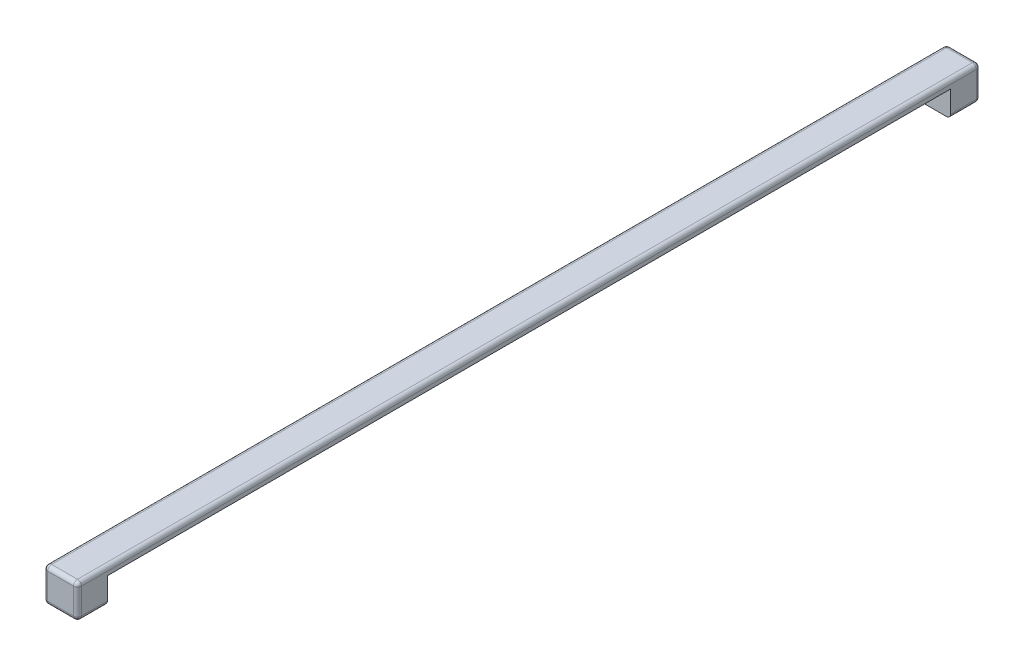
ISO-10303-21;
HEADER;
FILE_DESCRIPTION(('STEP AP214'),'2;1');
FILE_NAME('part.step','',(''),(''),'','','');
FILE_SCHEMA(('AUTOMOTIVE_DESIGN { 1 0 10303 214 1 1 1 1 }'));
ENDSEC;
DATA;
#1=APPLICATION_CONTEXT('core data for automotive mechanical design processes');
#2=APPLICATION_PROTOCOL_DEFINITION('international standard','automotive_design',2000,#1);
#3=PRODUCT_CONTEXT('',#1,'mechanical');
#4=PRODUCT('Part','Part','',(#3));
#5=PRODUCT_RELATED_PRODUCT_CATEGORY('part','',(#4));
#6=PRODUCT_DEFINITION_FORMATION('','',#4);
#7=PRODUCT_DEFINITION_CONTEXT('part definition',#1,'design');
#8=PRODUCT_DEFINITION('design','',#6,#7);
#9=PRODUCT_DEFINITION_SHAPE('','',#8);
#10=(LENGTH_UNIT() NAMED_UNIT(*) SI_UNIT(.MILLI.,.METRE.));
#11=(NAMED_UNIT(*) PLANE_ANGLE_UNIT() SI_UNIT($,.RADIAN.));
#12=(NAMED_UNIT(*) SI_UNIT($,.STERADIAN.) SOLID_ANGLE_UNIT());
#13=UNCERTAINTY_MEASURE_WITH_UNIT(LENGTH_MEASURE(1.E-05),#10,'distance_accuracy_value','');
#14=(GEOMETRIC_REPRESENTATION_CONTEXT(3) GLOBAL_UNCERTAINTY_ASSIGNED_CONTEXT((#13)) GLOBAL_UNIT_ASSIGNED_CONTEXT((#10,
#11,#12)) REPRESENTATION_CONTEXT('',''));
#15=CARTESIAN_POINT('',(0.,0.,0.));
#16=DIRECTION('',(0.,0.,1.));
#17=DIRECTION('',(1.,0.,0.));
#18=AXIS2_PLACEMENT_3D('',#15,#16,#17);
#19=CARTESIAN_POINT('',(4.25,-4.25,113.5));
#20=DIRECTION('',(-1.,0.,0.));
#21=DIRECTION('',(0.,0.,1.));
#22=AXIS2_PLACEMENT_3D('',#19,#20,#21);
#23=PLANE('',#22);
#24=DIRECTION('',(0.,-1.,0.));
#25=VECTOR('',#24,1.);
#26=CARTESIAN_POINT('',(4.25,-4.25,106.));
#27=LINE('',#26,#25);
#28=CARTESIAN_POINT('',(4.25,2.25,106.));
#29=VERTEX_POINT('',#28);
#30=CARTESIAN_POINT('',(4.25,-3.25,106.));
#31=VERTEX_POINT('',#30);
#32=EDGE_CURVE('E190',#29,#31,#27,.T.);
#33=ORIENTED_EDGE('',*,*,#32,.F.);
#34=DIRECTION('',(0.,0.,-1.));
#35=VECTOR('',#34,1.);
#36=CARTESIAN_POINT('',(4.25,2.25,122.692388155425));
#37=LINE('',#36,#35);
#38=CARTESIAN_POINT('',(4.25,2.25,-106.));
#39=VERTEX_POINT('',#38);
#40=EDGE_CURVE('E172',#29,#39,#37,.T.);
#41=ORIENTED_EDGE('',*,*,#40,.T.);
#42=DIRECTION('',(0.,1.,0.));
#43=VECTOR('',#42,1.);
#44=CARTESIAN_POINT('',(4.25,-4.25,-106.));
#45=LINE('',#44,#43);
#46=CARTESIAN_POINT('',(4.25,-3.25,-106.));
#47=VERTEX_POINT('',#46);
#48=EDGE_CURVE('E181',#47,#39,#45,.T.);
#49=ORIENTED_EDGE('',*,*,#48,.F.);
#50=DIRECTION('',(0.,0.,-1.));
#51=VECTOR('',#50,1.);
#52=CARTESIAN_POINT('',(4.25,-3.25,113.5));
#53=LINE('',#52,#51);
#54=CARTESIAN_POINT('',(4.25,-3.25,-112.5));
#55=VERTEX_POINT('',#54);
#56=EDGE_CURVE('E224',#47,#55,#53,.T.);
#57=ORIENTED_EDGE('',*,*,#56,.T.);
#58=DIRECTION('',(0.,1.,0.));
#59=VECTOR('',#58,1.);
#60=CARTESIAN_POINT('',(4.25,4.25,-112.5));
#61=LINE('',#60,#59);
#62=CARTESIAN_POINT('',(4.25,3.25,-112.5));
#63=VERTEX_POINT('',#62);
#64=EDGE_CURVE('E228',#55,#63,#61,.T.);
#65=ORIENTED_EDGE('',*,*,#64,.T.);
#66=DIRECTION('',(0.,0.,-1.));
#67=VECTOR('',#66,1.);
#68=CARTESIAN_POINT('',(4.25,3.25,113.5));
#69=LINE('',#68,#67);
#70=CARTESIAN_POINT('',(4.25,3.25,112.5));
#71=VERTEX_POINT('',#70);
#72=EDGE_CURVE('E230',#63,#71,#69,.F.);
#73=ORIENTED_EDGE('',*,*,#72,.T.);
#74=DIRECTION('',(0.,1.,0.));
#75=VECTOR('',#74,1.);
#76=CARTESIAN_POINT('',(4.25,-4.25,112.5));
#77=LINE('',#76,#75);
#78=CARTESIAN_POINT('',(4.25,-3.25,112.5));
#79=VERTEX_POINT('',#78);
#80=EDGE_CURVE('E232',#71,#79,#77,.F.);
#81=ORIENTED_EDGE('',*,*,#80,.T.);
#82=EDGE_CURVE('E225',#79,#31,#53,.T.);
#83=ORIENTED_EDGE('',*,*,#82,.T.);
#84=EDGE_LOOP('',(#33,#41,#49,#57,#65,#73,#81,#83));
#85=FACE_BOUND('',#84,.T.);
#86=ADVANCED_FACE('F40',(#85),#23,.F.);
#87=CARTESIAN_POINT('',(-4.25,-4.25,113.5));
#88=DIRECTION('',(0.,1.,0.));
#89=DIRECTION('',(0.,0.,1.));
#90=AXIS2_PLACEMENT_3D('',#87,#88,#89);
#91=PLANE('',#90);
#92=DIRECTION('',(-1.,0.,0.));
#93=VECTOR('',#92,1.);
#94=CARTESIAN_POINT('',(4.25,-4.25,106.));
#95=LINE('',#94,#93);
#96=CARTESIAN_POINT('',(3.25,-4.25,106.));
#97=VERTEX_POINT('',#96);
#98=CARTESIAN_POINT('',(-2.25,-4.25,106.));
#99=VERTEX_POINT('',#98);
#100=EDGE_CURVE('E188',#97,#99,#95,.T.);
#101=ORIENTED_EDGE('',*,*,#100,.F.);
#102=DIRECTION('',(0.,0.,-1.));
#103=VECTOR('',#102,1.);
#104=CARTESIAN_POINT('',(3.25,-4.25,113.5));
#105=LINE('',#104,#103);
#106=CARTESIAN_POINT('',(3.25,-4.25,112.5));
#107=VERTEX_POINT('',#106);
#108=EDGE_CURVE('E246',#97,#107,#105,.F.);
#109=ORIENTED_EDGE('',*,*,#108,.T.);
#110=DIRECTION('',(1.,0.,0.));
#111=VECTOR('',#110,1.);
#112=CARTESIAN_POINT('',(-4.25,-4.25,112.5));
#113=LINE('',#112,#111);
#114=CARTESIAN_POINT('',(-3.25,-4.25,112.5));
#115=VERTEX_POINT('',#114);
#116=EDGE_CURVE('E63',#107,#115,#113,.F.);
#117=ORIENTED_EDGE('',*,*,#116,.T.);
#118=DIRECTION('',(0.,0.,-1.));
#119=VECTOR('',#118,1.);
#120=CARTESIAN_POINT('',(-3.25,-4.25,113.5));
#121=LINE('',#120,#119);
#122=CARTESIAN_POINT('',(-3.25,-4.25,-112.5));
#123=VERTEX_POINT('',#122);
#124=EDGE_CURVE('E251',#115,#123,#121,.T.);
#125=ORIENTED_EDGE('',*,*,#124,.T.);
#126=DIRECTION('',(1.,0.,0.));
#127=VECTOR('',#126,1.);
#128=CARTESIAN_POINT('',(4.25,-4.25,-112.5));
#129=LINE('',#128,#127);
#130=CARTESIAN_POINT('',(3.25,-4.25,-112.5));
#131=VERTEX_POINT('',#130);
#132=EDGE_CURVE('E244',#123,#131,#129,.T.);
#133=ORIENTED_EDGE('',*,*,#132,.T.);
#134=CARTESIAN_POINT('',(3.25,-4.25,-106.));
#135=VERTEX_POINT('',#134);
#136=EDGE_CURVE('E247',#131,#135,#105,.F.);
#137=ORIENTED_EDGE('',*,*,#136,.T.);
#138=DIRECTION('',(1.,0.,0.));
#139=VECTOR('',#138,1.);
#140=CARTESIAN_POINT('',(4.25,-4.25,-106.));
#141=LINE('',#140,#139);
#142=CARTESIAN_POINT('',(-2.25,-4.25,-106.));
#143=VERTEX_POINT('',#142);
#144=EDGE_CURVE('E55',#143,#135,#141,.T.);
#145=ORIENTED_EDGE('',*,*,#144,.F.);
#146=DIRECTION('',(0.,0.,-1.));
#147=VECTOR('',#146,1.);
#148=CARTESIAN_POINT('',(-2.25,-4.25,122.692388155425));
#149=LINE('',#148,#147);
#150=EDGE_CURVE('E173',#99,#143,#149,.T.);
#151=ORIENTED_EDGE('',*,*,#150,.F.);
#152=EDGE_LOOP('',(#101,#109,#117,#125,#133,#137,#145,#151));
#153=FACE_BOUND('',#152,.T.);
#154=ADVANCED_FACE('F370',(#153),#91,.F.);
#155=CARTESIAN_POINT('',(3.25,-3.25,113.5));
#156=DIRECTION('',(0.,0.,-1.));
#157=DIRECTION('',(-1.,0.,0.));
#158=AXIS2_PLACEMENT_3D('',#155,#156,#157);
#159=CYLINDRICAL_SURFACE('',#158,1.);
#160=ORIENTED_EDGE('',*,*,#108,.F.);
#161=CARTESIAN_POINT('',(3.25,-3.25,106.));
#162=DIRECTION('',(0.,0.,-1.));
#163=DIRECTION('',(-1.,0.,0.));
#164=AXIS2_PLACEMENT_3D('',#161,#162,#163);
#165=CIRCLE('',#164,1.);
#166=EDGE_CURVE('E12',#97,#31,#165,.F.);
#167=ORIENTED_EDGE('',*,*,#166,.T.);
#168=ORIENTED_EDGE('',*,*,#82,.F.);
#169=CARTESIAN_POINT('',(3.25,-3.25,112.5));
#170=DIRECTION('',(0.,0.,1.));
#171=DIRECTION('',(1.,0.,0.));
#172=AXIS2_PLACEMENT_3D('',#169,#170,#171);
#173=CIRCLE('',#172,1.);
#174=EDGE_CURVE('E293',#107,#79,#173,.T.);
#175=ORIENTED_EDGE('',*,*,#174,.F.);
#176=EDGE_LOOP('',(#160,#167,#168,#175));
#177=FACE_BOUND('',#176,.T.);
#178=ADVANCED_FACE('F366',(#177),#159,.T.);
#179=CARTESIAN_POINT('',(-4.25,4.25,113.5));
#180=DIRECTION('',(0.,-1.,0.));
#181=DIRECTION('',(0.,0.,-1.));
#182=AXIS2_PLACEMENT_3D('',#179,#180,#181);
#183=PLANE('',#182);
#184=DIRECTION('',(0.,0.,-1.));
#185=VECTOR('',#184,1.);
#186=CARTESIAN_POINT('',(-3.25,4.25,113.5));
#187=LINE('',#186,#185);
#188=CARTESIAN_POINT('',(-3.25,4.25,-112.5));
#189=VERTEX_POINT('',#188);
#190=CARTESIAN_POINT('',(-3.25,4.25,112.5));
#191=VERTEX_POINT('',#190);
#192=EDGE_CURVE('E210',#189,#191,#187,.F.);
#193=ORIENTED_EDGE('',*,*,#192,.T.);
#194=DIRECTION('',(-1.,0.,0.));
#195=VECTOR('',#194,1.);
#196=CARTESIAN_POINT('',(-4.25,4.25,112.5));
#197=LINE('',#196,#195);
#198=CARTESIAN_POINT('',(3.25,4.25,112.5));
#199=VERTEX_POINT('',#198);
#200=EDGE_CURVE('E212',#191,#199,#197,.F.);
#201=ORIENTED_EDGE('',*,*,#200,.T.);
#202=DIRECTION('',(0.,0.,-1.));
#203=VECTOR('',#202,1.);
#204=CARTESIAN_POINT('',(3.25,4.25,113.5));
#205=LINE('',#204,#203);
#206=CARTESIAN_POINT('',(3.25,4.25,-112.5));
#207=VERTEX_POINT('',#206);
#208=EDGE_CURVE('E208',#199,#207,#205,.T.);
#209=ORIENTED_EDGE('',*,*,#208,.T.);
#210=DIRECTION('',(-1.,0.,0.));
#211=VECTOR('',#210,1.);
#212=CARTESIAN_POINT('',(-4.25,4.25,-112.5));
#213=LINE('',#212,#211);
#214=EDGE_CURVE('E206',#207,#189,#213,.T.);
#215=ORIENTED_EDGE('',*,*,#214,.T.);
#216=EDGE_LOOP('',(#193,#201,#209,#215));
#217=FACE_BOUND('',#216,.T.);
#218=ADVANCED_FACE('F398',(#217),#183,.F.);
#219=CARTESIAN_POINT('',(-4.25,-4.25,113.5));
#220=DIRECTION('',(1.,0.,0.));
#221=DIRECTION('',(0.,0.,-1.));
#222=AXIS2_PLACEMENT_3D('',#219,#220,#221);
#223=PLANE('',#222);
#224=DIRECTION('',(0.,-1.,0.));
#225=VECTOR('',#224,1.);
#226=CARTESIAN_POINT('',(-4.25,-4.25,112.5));
#227=LINE('',#226,#225);
#228=CARTESIAN_POINT('',(-4.25,-3.25,112.5));
#229=VERTEX_POINT('',#228);
#230=CARTESIAN_POINT('',(-4.25,3.25,112.5));
#231=VERTEX_POINT('',#230);
#232=EDGE_CURVE('E219',#229,#231,#227,.F.);
#233=ORIENTED_EDGE('',*,*,#232,.T.);
#234=DIRECTION('',(0.,0.,-1.));
#235=VECTOR('',#234,1.);
#236=CARTESIAN_POINT('',(-4.25,3.25,113.5));
#237=LINE('',#236,#235);
#238=CARTESIAN_POINT('',(-4.25,3.25,-112.5));
#239=VERTEX_POINT('',#238);
#240=EDGE_CURVE('E221',#231,#239,#237,.T.);
#241=ORIENTED_EDGE('',*,*,#240,.T.);
#242=DIRECTION('',(0.,-1.,0.));
#243=VECTOR('',#242,1.);
#244=CARTESIAN_POINT('',(-4.25,-4.25,-112.5));
#245=LINE('',#244,#243);
#246=CARTESIAN_POINT('',(-4.25,-3.25,-112.5));
#247=VERTEX_POINT('',#246);
#248=EDGE_CURVE('E217',#239,#247,#245,.T.);
#249=ORIENTED_EDGE('',*,*,#248,.T.);
#250=DIRECTION('',(0.,0.,-1.));
#251=VECTOR('',#250,1.);
#252=CARTESIAN_POINT('',(-4.25,-3.25,113.5));
#253=LINE('',#252,#251);
#254=EDGE_CURVE('E215',#247,#229,#253,.F.);
#255=ORIENTED_EDGE('',*,*,#254,.T.);
#256=EDGE_LOOP('',(#233,#241,#249,#255));
#257=FACE_BOUND('',#256,.T.);
#258=ADVANCED_FACE('F602',(#257),#223,.F.);
#259=CARTESIAN_POINT('',(0.,0.,113.5));
#260=DIRECTION('',(0.,0.,-1.));
#261=DIRECTION('',(-1.,0.,0.));
#262=AXIS2_PLACEMENT_3D('',#259,#260,#261);
#263=PLANE('',#262);
#264=DIRECTION('',(0.,1.,0.));
#265=VECTOR('',#264,1.);
#266=CARTESIAN_POINT('',(3.25,0.,113.5));
#267=LINE('',#266,#265);
#268=CARTESIAN_POINT('',(3.25,-3.25,113.5));
#269=VERTEX_POINT('',#268);
#270=CARTESIAN_POINT('',(3.25,3.25,113.5));
#271=VERTEX_POINT('',#270);
#272=EDGE_CURVE('E198',#269,#271,#267,.T.);
#273=ORIENTED_EDGE('',*,*,#272,.T.);
#274=DIRECTION('',(-1.,0.,0.));
#275=VECTOR('',#274,1.);
#276=CARTESIAN_POINT('',(0.,3.25,113.5));
#277=LINE('',#276,#275);
#278=CARTESIAN_POINT('',(-3.25,3.25,113.5));
#279=VERTEX_POINT('',#278);
#280=EDGE_CURVE('E203',#271,#279,#277,.T.);
#281=ORIENTED_EDGE('',*,*,#280,.T.);
#282=DIRECTION('',(0.,-1.,0.));
#283=VECTOR('',#282,1.);
#284=CARTESIAN_POINT('',(-3.25,0.,113.5));
#285=LINE('',#284,#283);
#286=CARTESIAN_POINT('',(-3.25,-3.25,113.5));
#287=VERTEX_POINT('',#286);
#288=EDGE_CURVE('E201',#279,#287,#285,.T.);
#289=ORIENTED_EDGE('',*,*,#288,.T.);
#290=DIRECTION('',(1.,0.,0.));
#291=VECTOR('',#290,1.);
#292=CARTESIAN_POINT('',(0.,-3.25,113.5));
#293=LINE('',#292,#291);
#294=EDGE_CURVE('E196',#287,#269,#293,.T.);
#295=ORIENTED_EDGE('',*,*,#294,.T.);
#296=EDGE_LOOP('',(#273,#281,#289,#295));
#297=FACE_BOUND('',#296,.T.);
#298=ADVANCED_FACE('F353',(#297),#263,.F.);
#299=CARTESIAN_POINT('',(0.,0.,-113.5));
#300=DIRECTION('',(0.,0.,-1.));
#301=DIRECTION('',(-1.,0.,0.));
#302=AXIS2_PLACEMENT_3D('',#299,#300,#301);
#303=PLANE('',#302);
#304=DIRECTION('',(0.,-1.,0.));
#305=VECTOR('',#304,1.);
#306=CARTESIAN_POINT('',(-3.25,4.25,-113.5));
#307=LINE('',#306,#305);
#308=CARTESIAN_POINT('',(-3.25,-3.25,-113.5));
#309=VERTEX_POINT('',#308);
#310=CARTESIAN_POINT('',(-3.25,3.25,-113.5));
#311=VERTEX_POINT('',#310);
#312=EDGE_CURVE('E239',#309,#311,#307,.F.);
#313=ORIENTED_EDGE('',*,*,#312,.T.);
#314=DIRECTION('',(-1.,0.,0.));
#315=VECTOR('',#314,1.);
#316=CARTESIAN_POINT('',(4.25,3.25,-113.5));
#317=LINE('',#316,#315);
#318=CARTESIAN_POINT('',(3.25,3.25,-113.5));
#319=VERTEX_POINT('',#318);
#320=EDGE_CURVE('E241',#311,#319,#317,.F.);
#321=ORIENTED_EDGE('',*,*,#320,.T.);
#322=DIRECTION('',(0.,1.,0.));
#323=VECTOR('',#322,1.);
#324=CARTESIAN_POINT('',(3.25,-4.25,-113.5));
#325=LINE('',#324,#323);
#326=CARTESIAN_POINT('',(3.25,-3.25,-113.5));
#327=VERTEX_POINT('',#326);
#328=EDGE_CURVE('E237',#319,#327,#325,.F.);
#329=ORIENTED_EDGE('',*,*,#328,.T.);
#330=DIRECTION('',(1.,0.,0.));
#331=VECTOR('',#330,1.);
#332=CARTESIAN_POINT('',(-4.25,-3.25,-113.5));
#333=LINE('',#332,#331);
#334=EDGE_CURVE('E235',#327,#309,#333,.F.);
#335=ORIENTED_EDGE('',*,*,#334,.T.);
#336=EDGE_LOOP('',(#313,#321,#329,#335));
#337=FACE_BOUND('',#336,.T.);
#338=ADVANCED_FACE('F377',(#337),#303,.T.);
#339=CARTESIAN_POINT('',(-4.25,-3.25,-112.5));
#340=DIRECTION('',(-1.,0.,0.));
#341=DIRECTION('',(0.,0.,1.));
#342=AXIS2_PLACEMENT_3D('',#339,#340,#341);
#343=CYLINDRICAL_SURFACE('',#342,1.);
#344=CARTESIAN_POINT('',(3.25,-3.25,-112.5));
#345=DIRECTION('',(1.,0.,0.));
#346=DIRECTION('',(0.,0.,-1.));
#347=AXIS2_PLACEMENT_3D('',#344,#345,#346);
#348=CIRCLE('',#347,1.);
#349=EDGE_CURVE('E199',#131,#327,#348,.T.);
#350=ORIENTED_EDGE('',*,*,#349,.F.);
#351=ORIENTED_EDGE('',*,*,#132,.F.);
#352=CARTESIAN_POINT('',(-3.25,-3.25,-112.5));
#353=DIRECTION('',(-1.,0.,0.));
#354=DIRECTION('',(0.,0.,1.));
#355=AXIS2_PLACEMENT_3D('',#352,#353,#354);
#356=CIRCLE('',#355,1.);
#357=EDGE_CURVE('E312',#309,#123,#356,.T.);
#358=ORIENTED_EDGE('',*,*,#357,.F.);
#359=ORIENTED_EDGE('',*,*,#334,.F.);
#360=EDGE_LOOP('',(#350,#351,#358,#359));
#361=FACE_BOUND('',#360,.T.);
#362=ADVANCED_FACE('F42',(#361),#343,.T.);
#363=CARTESIAN_POINT('',(3.25,-3.25,-112.5));
#364=DIRECTION('',(0.,0.,1.));
#365=DIRECTION('',(1.,0.,0.));
#366=AXIS2_PLACEMENT_3D('',#363,#364,#365);
#367=SPHERICAL_SURFACE('',#366,1.);
#368=CARTESIAN_POINT('',(3.25,-3.25,-112.5));
#369=DIRECTION('',(0.,0.,-1.));
#370=DIRECTION('',(-1.,0.,0.));
#371=AXIS2_PLACEMENT_3D('',#368,#369,#370);
#372=CIRCLE('',#371,1.);
#373=EDGE_CURVE('E306',#131,#55,#372,.F.);
#374=ORIENTED_EDGE('',*,*,#373,.F.);
#375=ORIENTED_EDGE('',*,*,#349,.T.);
#376=CARTESIAN_POINT('',(3.25,-3.25,-112.5));
#377=DIRECTION('',(0.,-1.,0.));
#378=DIRECTION('',(0.,0.,-1.));
#379=AXIS2_PLACEMENT_3D('',#376,#377,#378);
#380=CIRCLE('',#379,1.);
#381=EDGE_CURVE('E309',#55,#327,#380,.F.);
#382=ORIENTED_EDGE('',*,*,#381,.F.);
#383=EDGE_LOOP('',(#374,#375,#382));
#384=FACE_BOUND('',#383,.T.);
#385=ADVANCED_FACE('F326',(#384),#367,.T.);
#386=CARTESIAN_POINT('',(-3.25,-3.25,-112.5));
#387=DIRECTION('',(0.,0.,1.));
#388=DIRECTION('',(1.,0.,0.));
#389=AXIS2_PLACEMENT_3D('',#386,#387,#388);
#390=SPHERICAL_SURFACE('',#389,1.);
#391=CARTESIAN_POINT('',(-3.25,-3.25,-112.5));
#392=DIRECTION('',(0.,-1.,0.));
#393=DIRECTION('',(0.,0.,-1.));
#394=AXIS2_PLACEMENT_3D('',#391,#392,#393);
#395=CIRCLE('',#394,1.);
#396=EDGE_CURVE('E301',#309,#247,#395,.F.);
#397=ORIENTED_EDGE('',*,*,#396,.F.);
#398=ORIENTED_EDGE('',*,*,#357,.T.);
#399=CARTESIAN_POINT('',(-3.25,-3.25,-112.5));
#400=DIRECTION('',(0.,0.,-1.));
#401=DIRECTION('',(-1.,0.,0.));
#402=AXIS2_PLACEMENT_3D('',#399,#400,#401);
#403=CIRCLE('',#402,1.);
#404=EDGE_CURVE('E304',#247,#123,#403,.F.);
#405=ORIENTED_EDGE('',*,*,#404,.F.);
#406=EDGE_LOOP('',(#397,#398,#405));
#407=FACE_BOUND('',#406,.T.);
#408=ADVANCED_FACE('F451',(#407),#390,.T.);
#409=CARTESIAN_POINT('',(3.25,-4.25,-112.5));
#410=DIRECTION('',(0.,-1.,0.));
#411=DIRECTION('',(0.,0.,-1.));
#412=AXIS2_PLACEMENT_3D('',#409,#410,#411);
#413=CYLINDRICAL_SURFACE('',#412,1.);
#414=ORIENTED_EDGE('',*,*,#381,.T.);
#415=ORIENTED_EDGE('',*,*,#328,.F.);
#416=CARTESIAN_POINT('',(3.25,3.25,-112.5));
#417=DIRECTION('',(0.,1.,0.));
#418=DIRECTION('',(0.,0.,1.));
#419=AXIS2_PLACEMENT_3D('',#416,#417,#418);
#420=CIRCLE('',#419,1.);
#421=EDGE_CURVE('E296',#63,#319,#420,.T.);
#422=ORIENTED_EDGE('',*,*,#421,.F.);
#423=ORIENTED_EDGE('',*,*,#64,.F.);
#424=EDGE_LOOP('',(#414,#415,#422,#423));
#425=FACE_BOUND('',#424,.T.);
#426=ADVANCED_FACE('F331',(#425),#413,.T.);
#427=CARTESIAN_POINT('',(3.25,-3.25,-106.));
#428=DIRECTION('',(0.,0.,-1.));
#429=DIRECTION('',(-1.,0.,0.));
#430=AXIS2_PLACEMENT_3D('',#427,#428,#429);
#431=CIRCLE('',#430,1.);
#432=EDGE_CURVE('E48',#135,#47,#431,.F.);
#433=ORIENTED_EDGE('',*,*,#432,.F.);
#434=ORIENTED_EDGE('',*,*,#136,.F.);
#435=ORIENTED_EDGE('',*,*,#373,.T.);
#436=ORIENTED_EDGE('',*,*,#56,.F.);
#437=EDGE_LOOP('',(#433,#434,#435,#436));
#438=FACE_BOUND('',#437,.T.);
#439=ADVANCED_FACE('F321',(#438),#159,.T.);
#440=CARTESIAN_POINT('',(0.,-3.25,112.5));
#441=DIRECTION('',(1.,0.,0.));
#442=DIRECTION('',(0.,0.,-1.));
#443=AXIS2_PLACEMENT_3D('',#440,#441,#442);
#444=CYLINDRICAL_SURFACE('',#443,1.);
#445=CARTESIAN_POINT('',(-3.25,-3.25,112.5));
#446=DIRECTION('',(-1.,0.,0.));
#447=DIRECTION('',(0.,0.,1.));
#448=AXIS2_PLACEMENT_3D('',#445,#446,#447);
#449=CIRCLE('',#448,1.);
#450=EDGE_CURVE('E287',#115,#287,#449,.T.);
#451=ORIENTED_EDGE('',*,*,#450,.F.);
#452=ORIENTED_EDGE('',*,*,#116,.F.);
#453=CARTESIAN_POINT('',(3.25,-3.25,112.5));
#454=DIRECTION('',(1.,0.,0.));
#455=DIRECTION('',(0.,0.,-1.));
#456=AXIS2_PLACEMENT_3D('',#453,#454,#455);
#457=CIRCLE('',#456,1.);
#458=EDGE_CURVE('E290',#269,#107,#457,.T.);
#459=ORIENTED_EDGE('',*,*,#458,.F.);
#460=ORIENTED_EDGE('',*,*,#294,.F.);
#461=EDGE_LOOP('',(#451,#452,#459,#460));
#462=FACE_BOUND('',#461,.T.);
#463=ADVANCED_FACE('F359',(#462),#444,.T.);
#464=CARTESIAN_POINT('',(-3.25,-3.25,113.5));
#465=DIRECTION('',(0.,0.,-1.));
#466=DIRECTION('',(-1.,0.,0.));
#467=AXIS2_PLACEMENT_3D('',#464,#465,#466);
#468=CYLINDRICAL_SURFACE('',#467,1.);
#469=ORIENTED_EDGE('',*,*,#404,.T.);
#470=ORIENTED_EDGE('',*,*,#124,.F.);
#471=CARTESIAN_POINT('',(-3.25,-3.25,112.5));
#472=DIRECTION('',(0.,0.,1.));
#473=DIRECTION('',(1.,0.,0.));
#474=AXIS2_PLACEMENT_3D('',#471,#472,#473);
#475=CIRCLE('',#474,1.);
#476=EDGE_CURVE('E284',#229,#115,#475,.T.);
#477=ORIENTED_EDGE('',*,*,#476,.F.);
#478=ORIENTED_EDGE('',*,*,#254,.F.);
#479=EDGE_LOOP('',(#469,#470,#477,#478));
#480=FACE_BOUND('',#479,.T.);
#481=ADVANCED_FACE('F448',(#480),#468,.T.);
#482=CARTESIAN_POINT('',(-3.25,-4.25,-112.5));
#483=DIRECTION('',(0.,1.,0.));
#484=DIRECTION('',(0.,0.,1.));
#485=AXIS2_PLACEMENT_3D('',#482,#483,#484);
#486=CYLINDRICAL_SURFACE('',#485,1.);
#487=ORIENTED_EDGE('',*,*,#396,.T.);
#488=ORIENTED_EDGE('',*,*,#248,.F.);
#489=CARTESIAN_POINT('',(-3.25,3.25,-112.5));
#490=DIRECTION('',(0.,1.,0.));
#491=DIRECTION('',(0.,0.,1.));
#492=AXIS2_PLACEMENT_3D('',#489,#490,#491);
#493=CIRCLE('',#492,1.);
#494=EDGE_CURVE('E281',#311,#239,#493,.T.);
#495=ORIENTED_EDGE('',*,*,#494,.F.);
#496=ORIENTED_EDGE('',*,*,#312,.F.);
#497=EDGE_LOOP('',(#487,#488,#495,#496));
#498=FACE_BOUND('',#497,.T.);
#499=ADVANCED_FACE('F389',(#498),#486,.T.);
#500=CARTESIAN_POINT('',(-4.25,3.25,-112.5));
#501=DIRECTION('',(1.,0.,0.));
#502=DIRECTION('',(0.,0.,-1.));
#503=AXIS2_PLACEMENT_3D('',#500,#501,#502);
#504=CYLINDRICAL_SURFACE('',#503,1.);
#505=CARTESIAN_POINT('',(3.25,3.25,-112.5));
#506=DIRECTION('',(1.,0.,0.));
#507=DIRECTION('',(0.,0.,-1.));
#508=AXIS2_PLACEMENT_3D('',#505,#506,#507);
#509=CIRCLE('',#508,1.);
#510=EDGE_CURVE('E298',#319,#207,#509,.T.);
#511=ORIENTED_EDGE('',*,*,#510,.F.);
#512=ORIENTED_EDGE('',*,*,#320,.F.);
#513=CARTESIAN_POINT('',(-3.25,3.25,-112.5));
#514=DIRECTION('',(-1.,0.,0.));
#515=DIRECTION('',(0.,0.,1.));
#516=AXIS2_PLACEMENT_3D('',#513,#514,#515);
#517=CIRCLE('',#516,1.);
#518=EDGE_CURVE('E278',#189,#311,#517,.T.);
#519=ORIENTED_EDGE('',*,*,#518,.F.);
#520=ORIENTED_EDGE('',*,*,#214,.F.);
#521=EDGE_LOOP('',(#511,#512,#519,#520));
#522=FACE_BOUND('',#521,.T.);
#523=ADVANCED_FACE('F384',(#522),#504,.T.);
#524=CARTESIAN_POINT('',(3.25,3.25,-112.5));
#525=DIRECTION('',(0.,0.,1.));
#526=DIRECTION('',(1.,0.,0.));
#527=AXIS2_PLACEMENT_3D('',#524,#525,#526);
#528=SPHERICAL_SURFACE('',#527,1.);
#529=ORIENTED_EDGE('',*,*,#421,.T.);
#530=ORIENTED_EDGE('',*,*,#510,.T.);
#531=CARTESIAN_POINT('',(3.25,3.25,-112.5));
#532=DIRECTION('',(0.,0.,-1.));
#533=DIRECTION('',(-1.,0.,0.));
#534=AXIS2_PLACEMENT_3D('',#531,#532,#533);
#535=CIRCLE('',#534,1.);
#536=EDGE_CURVE('E275',#63,#207,#535,.F.);
#537=ORIENTED_EDGE('',*,*,#536,.F.);
#538=EDGE_LOOP('',(#529,#530,#537));
#539=FACE_BOUND('',#538,.T.);
#540=ADVANCED_FACE('F400',(#539),#528,.T.);
#541=CARTESIAN_POINT('',(3.25,-3.25,112.5));
#542=DIRECTION('',(0.,0.,1.));
#543=DIRECTION('',(1.,0.,0.));
#544=AXIS2_PLACEMENT_3D('',#541,#542,#543);
#545=SPHERICAL_SURFACE('',#544,1.);
#546=ORIENTED_EDGE('',*,*,#458,.T.);
#547=ORIENTED_EDGE('',*,*,#174,.T.);
#548=CARTESIAN_POINT('',(3.25,-3.25,112.5));
#549=DIRECTION('',(0.,-1.,0.));
#550=DIRECTION('',(0.,0.,-1.));
#551=AXIS2_PLACEMENT_3D('',#548,#549,#550);
#552=CIRCLE('',#551,1.);
#553=EDGE_CURVE('E273',#269,#79,#552,.F.);
#554=ORIENTED_EDGE('',*,*,#553,.F.);
#555=EDGE_LOOP('',(#546,#547,#554));
#556=FACE_BOUND('',#555,.T.);
#557=ADVANCED_FACE('F362',(#556),#545,.T.);
#558=CARTESIAN_POINT('',(-3.25,-3.25,112.5));
#559=DIRECTION('',(0.,0.,1.));
#560=DIRECTION('',(1.,0.,0.));
#561=AXIS2_PLACEMENT_3D('',#558,#559,#560);
#562=SPHERICAL_SURFACE('',#561,1.);
#563=ORIENTED_EDGE('',*,*,#476,.T.);
#564=ORIENTED_EDGE('',*,*,#450,.T.);
#565=CARTESIAN_POINT('',(-3.25,-3.25,112.5));
#566=DIRECTION('',(0.,-1.,0.));
#567=DIRECTION('',(0.,0.,-1.));
#568=AXIS2_PLACEMENT_3D('',#565,#566,#567);
#569=CIRCLE('',#568,1.);
#570=EDGE_CURVE('E270',#229,#287,#569,.F.);
#571=ORIENTED_EDGE('',*,*,#570,.F.);
#572=EDGE_LOOP('',(#563,#564,#571));
#573=FACE_BOUND('',#572,.T.);
#574=ADVANCED_FACE('F407',(#573),#562,.T.);
#575=CARTESIAN_POINT('',(-3.25,3.25,-112.5));
#576=DIRECTION('',(0.,0.,1.));
#577=DIRECTION('',(1.,0.,0.));
#578=AXIS2_PLACEMENT_3D('',#575,#576,#577);
#579=SPHERICAL_SURFACE('',#578,1.);
#580=ORIENTED_EDGE('',*,*,#518,.T.);
#581=ORIENTED_EDGE('',*,*,#494,.T.);
#582=CARTESIAN_POINT('',(-3.25,3.25,-112.5));
#583=DIRECTION('',(0.,0.,-1.));
#584=DIRECTION('',(-1.,0.,0.));
#585=AXIS2_PLACEMENT_3D('',#582,#583,#584);
#586=CIRCLE('',#585,1.);
#587=EDGE_CURVE('E268',#189,#239,#586,.F.);
#588=ORIENTED_EDGE('',*,*,#587,.F.);
#589=EDGE_LOOP('',(#580,#581,#588));
#590=FACE_BOUND('',#589,.T.);
#591=ADVANCED_FACE('F391',(#590),#579,.T.);
#592=CARTESIAN_POINT('',(3.25,3.25,113.5));
#593=DIRECTION('',(0.,0.,-1.));
#594=DIRECTION('',(-1.,0.,0.));
#595=AXIS2_PLACEMENT_3D('',#592,#593,#594);
#596=CYLINDRICAL_SURFACE('',#595,1.);
#597=ORIENTED_EDGE('',*,*,#536,.T.);
#598=ORIENTED_EDGE('',*,*,#208,.F.);
#599=CARTESIAN_POINT('',(3.25,3.25,112.5));
#600=DIRECTION('',(0.,0.,1.));
#601=DIRECTION('',(1.,0.,0.));
#602=AXIS2_PLACEMENT_3D('',#599,#600,#601);
#603=CIRCLE('',#602,1.);
#604=EDGE_CURVE('E265',#71,#199,#603,.T.);
#605=ORIENTED_EDGE('',*,*,#604,.F.);
#606=ORIENTED_EDGE('',*,*,#72,.F.);
#607=EDGE_LOOP('',(#597,#598,#605,#606));
#608=FACE_BOUND('',#607,.T.);
#609=ADVANCED_FACE('F344',(#608),#596,.T.);
#610=CARTESIAN_POINT('',(3.25,0.,112.5));
#611=DIRECTION('',(0.,1.,0.));
#612=DIRECTION('',(0.,0.,1.));
#613=AXIS2_PLACEMENT_3D('',#610,#611,#612);
#614=CYLINDRICAL_SURFACE('',#613,1.);
#615=ORIENTED_EDGE('',*,*,#553,.T.);
#616=ORIENTED_EDGE('',*,*,#80,.F.);
#617=CARTESIAN_POINT('',(3.25,3.25,112.5));
#618=DIRECTION('',(0.,1.,0.));
#619=DIRECTION('',(0.,0.,1.));
#620=AXIS2_PLACEMENT_3D('',#617,#618,#619);
#621=CIRCLE('',#620,1.);
#622=EDGE_CURVE('E262',#271,#71,#621,.T.);
#623=ORIENTED_EDGE('',*,*,#622,.F.);
#624=ORIENTED_EDGE('',*,*,#272,.F.);
#625=EDGE_LOOP('',(#615,#616,#623,#624));
#626=FACE_BOUND('',#625,.T.);
#627=ADVANCED_FACE('F339',(#626),#614,.T.);
#628=CARTESIAN_POINT('',(-3.25,0.,112.5));
#629=DIRECTION('',(0.,-1.,0.));
#630=DIRECTION('',(0.,0.,-1.));
#631=AXIS2_PLACEMENT_3D('',#628,#629,#630);
#632=CYLINDRICAL_SURFACE('',#631,1.);
#633=ORIENTED_EDGE('',*,*,#570,.T.);
#634=ORIENTED_EDGE('',*,*,#288,.F.);
#635=CARTESIAN_POINT('',(-3.25,3.25,112.5));
#636=DIRECTION('',(0.,1.,0.));
#637=DIRECTION('',(0.,0.,1.));
#638=AXIS2_PLACEMENT_3D('',#635,#636,#637);
#639=CIRCLE('',#638,1.);
#640=EDGE_CURVE('E259',#231,#279,#639,.T.);
#641=ORIENTED_EDGE('',*,*,#640,.F.);
#642=ORIENTED_EDGE('',*,*,#232,.F.);
#643=EDGE_LOOP('',(#633,#634,#641,#642));
#644=FACE_BOUND('',#643,.T.);
#645=ADVANCED_FACE('F429',(#644),#632,.T.);
#646=CARTESIAN_POINT('',(-3.25,3.25,113.5));
#647=DIRECTION('',(0.,0.,-1.));
#648=DIRECTION('',(-1.,0.,0.));
#649=AXIS2_PLACEMENT_3D('',#646,#647,#648);
#650=CYLINDRICAL_SURFACE('',#649,1.);
#651=ORIENTED_EDGE('',*,*,#587,.T.);
#652=ORIENTED_EDGE('',*,*,#240,.F.);
#653=CARTESIAN_POINT('',(-3.25,3.25,112.5));
#654=DIRECTION('',(0.,0.,1.));
#655=DIRECTION('',(1.,0.,0.));
#656=AXIS2_PLACEMENT_3D('',#653,#654,#655);
#657=CIRCLE('',#656,1.);
#658=EDGE_CURVE('E256',#191,#231,#657,.T.);
#659=ORIENTED_EDGE('',*,*,#658,.F.);
#660=ORIENTED_EDGE('',*,*,#192,.F.);
#661=EDGE_LOOP('',(#651,#652,#659,#660));
#662=FACE_BOUND('',#661,.T.);
#663=ADVANCED_FACE('F396',(#662),#650,.T.);
#664=CARTESIAN_POINT('',(3.25,3.25,112.5));
#665=DIRECTION('',(0.,0.,1.));
#666=DIRECTION('',(1.,0.,0.));
#667=AXIS2_PLACEMENT_3D('',#664,#665,#666);
#668=SPHERICAL_SURFACE('',#667,1.);
#669=ORIENTED_EDGE('',*,*,#622,.T.);
#670=ORIENTED_EDGE('',*,*,#604,.T.);
#671=CARTESIAN_POINT('',(3.25,3.25,112.5));
#672=DIRECTION('',(1.,0.,0.));
#673=DIRECTION('',(0.,0.,-1.));
#674=AXIS2_PLACEMENT_3D('',#671,#672,#673);
#675=CIRCLE('',#674,1.);
#676=EDGE_CURVE('E254',#271,#199,#675,.F.);
#677=ORIENTED_EDGE('',*,*,#676,.F.);
#678=EDGE_LOOP('',(#669,#670,#677));
#679=FACE_BOUND('',#678,.T.);
#680=ADVANCED_FACE('F346',(#679),#668,.T.);
#681=CARTESIAN_POINT('',(-3.25,3.25,112.5));
#682=DIRECTION('',(0.,0.,1.));
#683=DIRECTION('',(1.,0.,0.));
#684=AXIS2_PLACEMENT_3D('',#681,#682,#683);
#685=SPHERICAL_SURFACE('',#684,1.);
#686=ORIENTED_EDGE('',*,*,#658,.T.);
#687=ORIENTED_EDGE('',*,*,#640,.T.);
#688=CARTESIAN_POINT('',(-3.25,3.25,112.5));
#689=DIRECTION('',(-1.,0.,0.));
#690=DIRECTION('',(0.,0.,1.));
#691=AXIS2_PLACEMENT_3D('',#688,#689,#690);
#692=CIRCLE('',#691,1.);
#693=EDGE_CURVE('E192',#191,#279,#692,.F.);
#694=ORIENTED_EDGE('',*,*,#693,.F.);
#695=EDGE_LOOP('',(#686,#687,#694));
#696=FACE_BOUND('',#695,.T.);
#697=ADVANCED_FACE('F421',(#696),#685,.T.);
#698=CARTESIAN_POINT('',(0.,3.25,112.5));
#699=DIRECTION('',(-1.,0.,0.));
#700=DIRECTION('',(0.,0.,1.));
#701=AXIS2_PLACEMENT_3D('',#698,#699,#700);
#702=CYLINDRICAL_SURFACE('',#701,1.);
#703=ORIENTED_EDGE('',*,*,#676,.T.);
#704=ORIENTED_EDGE('',*,*,#200,.F.);
#705=ORIENTED_EDGE('',*,*,#693,.T.);
#706=ORIENTED_EDGE('',*,*,#280,.F.);
#707=EDGE_LOOP('',(#703,#704,#705,#706));
#708=FACE_BOUND('',#707,.T.);
#709=ADVANCED_FACE('F350',(#708),#702,.T.);
#710=CARTESIAN_POINT('',(-2.25,-4.25,122.692388155425));
#711=DIRECTION('',(1.,0.,0.));
#712=DIRECTION('',(0.,0.,-1.));
#713=AXIS2_PLACEMENT_3D('',#710,#711,#712);
#714=PLANE('',#713);
#715=ORIENTED_EDGE('',*,*,#150,.T.);
#716=DIRECTION('',(0.,-1.,0.));
#717=VECTOR('',#716,1.);
#718=CARTESIAN_POINT('',(-2.25,-4.25,-106.));
#719=LINE('',#718,#717);
#720=CARTESIAN_POINT('',(-2.25,2.25,-106.));
#721=VERTEX_POINT('',#720);
#722=EDGE_CURVE('E175',#721,#143,#719,.T.);
#723=ORIENTED_EDGE('',*,*,#722,.F.);
#724=DIRECTION('',(0.,0.,-1.));
#725=VECTOR('',#724,1.);
#726=CARTESIAN_POINT('',(-2.25,2.25,122.692388155425));
#727=LINE('',#726,#725);
#728=CARTESIAN_POINT('',(-2.25,2.25,106.));
#729=VERTEX_POINT('',#728);
#730=EDGE_CURVE('E161',#729,#721,#727,.T.);
#731=ORIENTED_EDGE('',*,*,#730,.F.);
#732=DIRECTION('',(0.,1.,0.));
#733=VECTOR('',#732,1.);
#734=CARTESIAN_POINT('',(-2.25,-4.25,106.));
#735=LINE('',#734,#733);
#736=EDGE_CURVE('E186',#99,#729,#735,.T.);
#737=ORIENTED_EDGE('',*,*,#736,.F.);
#738=EDGE_LOOP('',(#715,#723,#731,#737));
#739=FACE_BOUND('',#738,.T.);
#740=ADVANCED_FACE('F176',(#739),#714,.T.);
#741=CARTESIAN_POINT('',(4.25,2.25,122.692388155425));
#742=DIRECTION('',(0.,-1.,0.));
#743=DIRECTION('',(1.,0.,0.));
#744=AXIS2_PLACEMENT_3D('',#741,#742,#743);
#745=PLANE('',#744);
#746=ORIENTED_EDGE('',*,*,#730,.T.);
#747=DIRECTION('',(-1.,0.,0.));
#748=VECTOR('',#747,1.);
#749=CARTESIAN_POINT('',(4.25,2.25,-106.));
#750=LINE('',#749,#748);
#751=EDGE_CURVE('E165',#39,#721,#750,.T.);
#752=ORIENTED_EDGE('',*,*,#751,.F.);
#753=ORIENTED_EDGE('',*,*,#40,.F.);
#754=DIRECTION('',(1.,0.,0.));
#755=VECTOR('',#754,1.);
#756=CARTESIAN_POINT('',(4.25,2.25,106.));
#757=LINE('',#756,#755);
#758=EDGE_CURVE('E168',#729,#29,#757,.T.);
#759=ORIENTED_EDGE('',*,*,#758,.F.);
#760=EDGE_LOOP('',(#746,#752,#753,#759));
#761=FACE_BOUND('',#760,.T.);
#762=ADVANCED_FACE('F163',(#761),#745,.T.);
#763=CARTESIAN_POINT('',(0.,0.,106.));
#764=DIRECTION('',(0.,0.,-1.));
#765=DIRECTION('',(-1.,0.,0.));
#766=AXIS2_PLACEMENT_3D('',#763,#764,#765);
#767=PLANE('',#766);
#768=ORIENTED_EDGE('',*,*,#100,.T.);
#769=ORIENTED_EDGE('',*,*,#736,.T.);
#770=ORIENTED_EDGE('',*,*,#758,.T.);
#771=ORIENTED_EDGE('',*,*,#32,.T.);
#772=ORIENTED_EDGE('',*,*,#166,.F.);
#773=EDGE_LOOP('',(#768,#769,#770,#771,#772));
#774=FACE_BOUND('',#773,.T.);
#775=ADVANCED_FACE('F368',(#774),#767,.T.);
#776=CARTESIAN_POINT('',(0.,0.,-106.));
#777=DIRECTION('',(0.,0.,-1.));
#778=DIRECTION('',(-1.,0.,0.));
#779=AXIS2_PLACEMENT_3D('',#776,#777,#778);
#780=PLANE('',#779);
#781=ORIENTED_EDGE('',*,*,#432,.T.);
#782=ORIENTED_EDGE('',*,*,#48,.T.);
#783=ORIENTED_EDGE('',*,*,#751,.T.);
#784=ORIENTED_EDGE('',*,*,#722,.T.);
#785=ORIENTED_EDGE('',*,*,#144,.T.);
#786=EDGE_LOOP('',(#781,#782,#783,#784,#785));
#787=FACE_BOUND('',#786,.T.);
#788=ADVANCED_FACE('F179',(#787),#780,.F.);
#789=CLOSED_SHELL('',(#86,#154,#178,#218,#258,#298,#338,#362,#385,#408,#426,#439,#463,#481,#499,
#523,#540,#557,#574,#591,#609,#627,#645,#663,#680,#697,#709,#740,#762,#775,#788));
#790=MANIFOLD_SOLID_BREP('B2',#789);
#791=ADVANCED_BREP_SHAPE_REPRESENTATION('',(#18,#790),#14);
#792=SHAPE_DEFINITION_REPRESENTATION(#9,#791);
ENDSEC;
END-ISO-10303-21;
